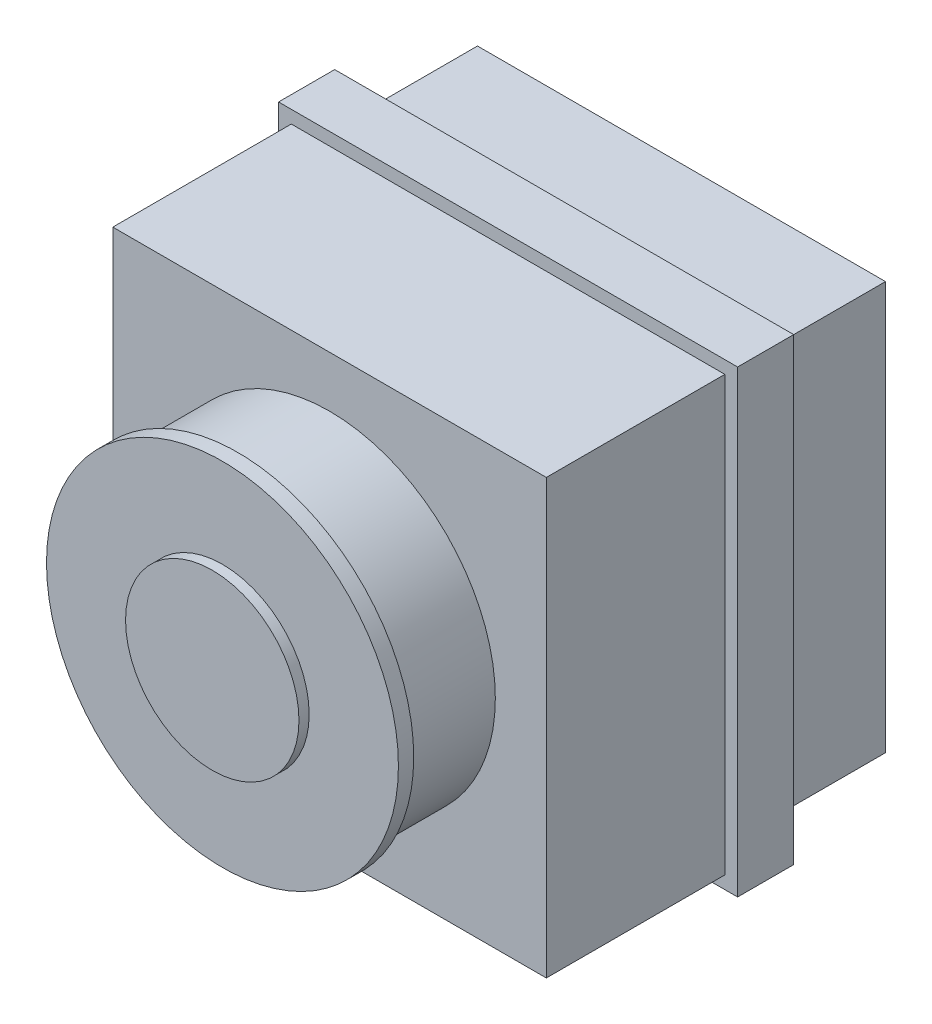
ISO-10303-21;
HEADER;
FILE_DESCRIPTION(('STEP AP214'),'2;1');
FILE_NAME('part.step','',(''),(''),'','','');
FILE_SCHEMA(('AUTOMOTIVE_DESIGN { 1 0 10303 214 1 1 1 1 }'));
ENDSEC;
DATA;
#1=APPLICATION_CONTEXT('core data for automotive mechanical design processes');
#2=APPLICATION_PROTOCOL_DEFINITION('international standard','automotive_design',2000,#1);
#3=PRODUCT_CONTEXT('',#1,'mechanical');
#4=PRODUCT('Part','Part','',(#3));
#5=PRODUCT_RELATED_PRODUCT_CATEGORY('part','',(#4));
#6=PRODUCT_DEFINITION_FORMATION('','',#4);
#7=PRODUCT_DEFINITION_CONTEXT('part definition',#1,'design');
#8=PRODUCT_DEFINITION('design','',#6,#7);
#9=PRODUCT_DEFINITION_SHAPE('','',#8);
#10=(LENGTH_UNIT() NAMED_UNIT(*) SI_UNIT(.MILLI.,.METRE.));
#11=(NAMED_UNIT(*) PLANE_ANGLE_UNIT() SI_UNIT($,.RADIAN.));
#12=(NAMED_UNIT(*) SI_UNIT($,.STERADIAN.) SOLID_ANGLE_UNIT());
#13=UNCERTAINTY_MEASURE_WITH_UNIT(LENGTH_MEASURE(1.E-05),#10,'distance_accuracy_value','');
#14=(GEOMETRIC_REPRESENTATION_CONTEXT(3) GLOBAL_UNCERTAINTY_ASSIGNED_CONTEXT((#13)) GLOBAL_UNIT_ASSIGNED_CONTEXT((#10,
#11,#12)) REPRESENTATION_CONTEXT('',''));
#15=CARTESIAN_POINT('',(0.,0.,0.));
#16=DIRECTION('',(0.,0.,1.));
#17=DIRECTION('',(1.,0.,0.));
#18=AXIS2_PLACEMENT_3D('',#15,#16,#17);
#19=CARTESIAN_POINT('',(26.,-21.,2.3));
#20=DIRECTION('',(1.,0.,0.));
#21=DIRECTION('',(0.,0.,-1.));
#22=AXIS2_PLACEMENT_3D('',#19,#20,#21);
#23=PLANE('',#22);
#24=DIRECTION('',(0.,-1.,0.));
#25=VECTOR('',#24,1.);
#26=CARTESIAN_POINT('',(26.,-21.,0.));
#27=LINE('',#26,#25);
#28=CARTESIAN_POINT('',(26.,-21.,0.));
#29=VERTEX_POINT('',#28);
#30=CARTESIAN_POINT('',(26.,-29.,0.));
#31=VERTEX_POINT('',#30);
#32=EDGE_CURVE('E184',#29,#31,#27,.T.);
#33=ORIENTED_EDGE('',*,*,#32,.T.);
#34=DIRECTION('',(0.,0.,-1.));
#35=VECTOR('',#34,1.);
#36=CARTESIAN_POINT('',(26.,-29.,2.3));
#37=LINE('',#36,#35);
#38=CARTESIAN_POINT('',(26.,-29.,2.3));
#39=VERTEX_POINT('',#38);
#40=EDGE_CURVE('E42',#39,#31,#37,.T.);
#41=ORIENTED_EDGE('',*,*,#40,.F.);
#42=DIRECTION('',(0.,-1.,0.));
#43=VECTOR('',#42,1.);
#44=CARTESIAN_POINT('',(26.,-21.,2.3));
#45=LINE('',#44,#43);
#46=CARTESIAN_POINT('',(26.,-21.,2.3));
#47=VERTEX_POINT('',#46);
#48=EDGE_CURVE('E185',#47,#39,#45,.T.);
#49=ORIENTED_EDGE('',*,*,#48,.F.);
#50=DIRECTION('',(0.,0.,-1.));
#51=VECTOR('',#50,1.);
#52=CARTESIAN_POINT('',(26.,-21.,2.3));
#53=LINE('',#52,#51);
#54=EDGE_CURVE('E198',#47,#29,#53,.T.);
#55=ORIENTED_EDGE('',*,*,#54,.T.);
#56=EDGE_LOOP('',(#33,#41,#49,#55));
#57=FACE_BOUND('',#56,.T.);
#58=ADVANCED_FACE('F39',(#57),#23,.F.);
#59=CARTESIAN_POINT('',(26.,-29.,2.3));
#60=DIRECTION('',(0.,1.,0.));
#61=DIRECTION('',(0.,0.,1.));
#62=AXIS2_PLACEMENT_3D('',#59,#60,#61);
#63=PLANE('',#62);
#64=DIRECTION('',(1.,0.,0.));
#65=VECTOR('',#64,1.);
#66=CARTESIAN_POINT('',(26.,-29.,0.));
#67=LINE('',#66,#65);
#68=CARTESIAN_POINT('',(34.,-29.,0.));
#69=VERTEX_POINT('',#68);
#70=EDGE_CURVE('E201',#31,#69,#67,.T.);
#71=ORIENTED_EDGE('',*,*,#70,.T.);
#72=DIRECTION('',(0.,0.,-1.));
#73=VECTOR('',#72,1.);
#74=CARTESIAN_POINT('',(34.,-29.,2.3));
#75=LINE('',#74,#73);
#76=CARTESIAN_POINT('',(34.,-29.,2.3));
#77=VERTEX_POINT('',#76);
#78=EDGE_CURVE('E210',#77,#69,#75,.T.);
#79=ORIENTED_EDGE('',*,*,#78,.F.);
#80=DIRECTION('',(1.,0.,0.));
#81=VECTOR('',#80,1.);
#82=CARTESIAN_POINT('',(26.,-29.,2.3));
#83=LINE('',#82,#81);
#84=EDGE_CURVE('E188',#39,#77,#83,.T.);
#85=ORIENTED_EDGE('',*,*,#84,.F.);
#86=ORIENTED_EDGE('',*,*,#40,.T.);
#87=EDGE_LOOP('',(#71,#79,#85,#86));
#88=FACE_BOUND('',#87,.T.);
#89=ADVANCED_FACE('F277',(#88),#63,.F.);
#90=CARTESIAN_POINT('',(34.,-29.,2.3));
#91=DIRECTION('',(-1.,0.,0.));
#92=DIRECTION('',(0.,0.,1.));
#93=AXIS2_PLACEMENT_3D('',#90,#91,#92);
#94=PLANE('',#93);
#95=DIRECTION('',(0.,1.,0.));
#96=VECTOR('',#95,1.);
#97=CARTESIAN_POINT('',(34.,-29.,0.));
#98=LINE('',#97,#96);
#99=CARTESIAN_POINT('',(34.,-21.,0.));
#100=VERTEX_POINT('',#99);
#101=EDGE_CURVE('E203',#69,#100,#98,.T.);
#102=ORIENTED_EDGE('',*,*,#101,.T.);
#103=DIRECTION('',(0.,0.,-1.));
#104=VECTOR('',#103,1.);
#105=CARTESIAN_POINT('',(34.,-21.,2.3));
#106=LINE('',#105,#104);
#107=CARTESIAN_POINT('',(34.,-21.,2.3));
#108=VERTEX_POINT('',#107);
#109=EDGE_CURVE('E208',#108,#100,#106,.T.);
#110=ORIENTED_EDGE('',*,*,#109,.F.);
#111=DIRECTION('',(0.,1.,0.));
#112=VECTOR('',#111,1.);
#113=CARTESIAN_POINT('',(34.,-29.,2.3));
#114=LINE('',#113,#112);
#115=EDGE_CURVE('E192',#77,#108,#114,.T.);
#116=ORIENTED_EDGE('',*,*,#115,.F.);
#117=ORIENTED_EDGE('',*,*,#78,.T.);
#118=EDGE_LOOP('',(#102,#110,#116,#117));
#119=FACE_BOUND('',#118,.T.);
#120=ADVANCED_FACE('F278',(#119),#94,.F.);
#121=CARTESIAN_POINT('',(34.,-21.,2.3));
#122=DIRECTION('',(0.,-1.,0.));
#123=DIRECTION('',(0.,0.,-1.));
#124=AXIS2_PLACEMENT_3D('',#121,#122,#123);
#125=PLANE('',#124);
#126=DIRECTION('',(-1.,0.,0.));
#127=VECTOR('',#126,1.);
#128=CARTESIAN_POINT('',(34.,-21.,0.));
#129=LINE('',#128,#127);
#130=EDGE_CURVE('E189',#100,#29,#129,.T.);
#131=ORIENTED_EDGE('',*,*,#130,.T.);
#132=ORIENTED_EDGE('',*,*,#54,.F.);
#133=DIRECTION('',(-1.,0.,0.));
#134=VECTOR('',#133,1.);
#135=CARTESIAN_POINT('',(34.,-21.,2.3));
#136=LINE('',#135,#134);
#137=EDGE_CURVE('E195',#108,#47,#136,.T.);
#138=ORIENTED_EDGE('',*,*,#137,.F.);
#139=ORIENTED_EDGE('',*,*,#109,.T.);
#140=EDGE_LOOP('',(#131,#132,#138,#139));
#141=FACE_BOUND('',#140,.T.);
#142=ADVANCED_FACE('F272',(#141),#125,.F.);
#143=CARTESIAN_POINT('',(0.,0.,0.));
#144=DIRECTION('',(0.,0.,1.));
#145=DIRECTION('',(1.,0.,0.));
#146=AXIS2_PLACEMENT_3D('',#143,#144,#145);
#147=PLANE('',#146);
#148=ORIENTED_EDGE('',*,*,#32,.F.);
#149=ORIENTED_EDGE('',*,*,#130,.F.);
#150=ORIENTED_EDGE('',*,*,#101,.F.);
#151=ORIENTED_EDGE('',*,*,#70,.F.);
#152=EDGE_LOOP('',(#148,#149,#150,#151));
#153=FACE_BOUND('',#152,.T.);
#154=ADVANCED_FACE('F267',(#153),#147,.F.);
#155=CARTESIAN_POINT('',(0.,0.,2.3));
#156=DIRECTION('',(0.,0.,1.));
#157=DIRECTION('',(1.,0.,0.));
#158=AXIS2_PLACEMENT_3D('',#155,#156,#157);
#159=PLANE('',#158);
#160=DIRECTION('',(0.,-1.,0.));
#161=VECTOR('',#160,1.);
#162=CARTESIAN_POINT('',(25.5,-20.5,2.3));
#163=LINE('',#162,#161);
#164=CARTESIAN_POINT('',(25.5,-20.5,2.3));
#165=VERTEX_POINT('',#164);
#166=CARTESIAN_POINT('',(25.5,-29.5,2.3));
#167=VERTEX_POINT('',#166);
#168=EDGE_CURVE('E149',#165,#167,#163,.T.);
#169=ORIENTED_EDGE('',*,*,#168,.F.);
#170=DIRECTION('',(-1.,0.,0.));
#171=VECTOR('',#170,1.);
#172=CARTESIAN_POINT('',(34.5,-20.5,2.3));
#173=LINE('',#172,#171);
#174=CARTESIAN_POINT('',(34.5,-20.5,2.3));
#175=VERTEX_POINT('',#174);
#176=EDGE_CURVE('E162',#175,#165,#173,.T.);
#177=ORIENTED_EDGE('',*,*,#176,.F.);
#178=DIRECTION('',(0.,1.,0.));
#179=VECTOR('',#178,1.);
#180=CARTESIAN_POINT('',(34.5,-29.5,2.3));
#181=LINE('',#180,#179);
#182=CARTESIAN_POINT('',(34.5,-29.5,2.3));
#183=VERTEX_POINT('',#182);
#184=EDGE_CURVE('E170',#183,#175,#181,.T.);
#185=ORIENTED_EDGE('',*,*,#184,.F.);
#186=DIRECTION('',(1.,0.,0.));
#187=VECTOR('',#186,1.);
#188=CARTESIAN_POINT('',(25.5,-29.5,2.3));
#189=LINE('',#188,#187);
#190=EDGE_CURVE('E152',#167,#183,#189,.T.);
#191=ORIENTED_EDGE('',*,*,#190,.F.);
#192=EDGE_LOOP('',(#169,#177,#185,#191));
#193=FACE_BOUND('',#192,.T.);
#194=ORIENTED_EDGE('',*,*,#137,.T.);
#195=ORIENTED_EDGE('',*,*,#48,.T.);
#196=ORIENTED_EDGE('',*,*,#84,.T.);
#197=ORIENTED_EDGE('',*,*,#115,.T.);
#198=EDGE_LOOP('',(#194,#195,#196,#197));
#199=FACE_BOUND('',#198,.T.);
#200=ADVANCED_FACE('F264',(#193,#199),#159,.F.);
#201=CARTESIAN_POINT('',(25.5,-20.5,3.4));
#202=DIRECTION('',(1.,0.,0.));
#203=DIRECTION('',(0.,0.,-1.));
#204=AXIS2_PLACEMENT_3D('',#201,#202,#203);
#205=PLANE('',#204);
#206=ORIENTED_EDGE('',*,*,#168,.T.);
#207=DIRECTION('',(0.,0.,-1.));
#208=VECTOR('',#207,1.);
#209=CARTESIAN_POINT('',(25.5,-29.5,3.4));
#210=LINE('',#209,#208);
#211=CARTESIAN_POINT('',(25.5,-29.5,3.4));
#212=VERTEX_POINT('',#211);
#213=EDGE_CURVE('E181',#212,#167,#210,.T.);
#214=ORIENTED_EDGE('',*,*,#213,.F.);
#215=DIRECTION('',(0.,-1.,0.));
#216=VECTOR('',#215,1.);
#217=CARTESIAN_POINT('',(25.5,-20.5,3.4));
#218=LINE('',#217,#216);
#219=CARTESIAN_POINT('',(25.5,-20.5,3.4));
#220=VERTEX_POINT('',#219);
#221=EDGE_CURVE('E158',#220,#212,#218,.T.);
#222=ORIENTED_EDGE('',*,*,#221,.F.);
#223=DIRECTION('',(0.,0.,-1.));
#224=VECTOR('',#223,1.);
#225=CARTESIAN_POINT('',(25.5,-20.5,3.4));
#226=LINE('',#225,#224);
#227=EDGE_CURVE('E167',#220,#165,#226,.T.);
#228=ORIENTED_EDGE('',*,*,#227,.T.);
#229=EDGE_LOOP('',(#206,#214,#222,#228));
#230=FACE_BOUND('',#229,.T.);
#231=ADVANCED_FACE('F252',(#230),#205,.F.);
#232=CARTESIAN_POINT('',(25.5,-29.5,3.4));
#233=DIRECTION('',(0.,1.,0.));
#234=DIRECTION('',(0.,0.,1.));
#235=AXIS2_PLACEMENT_3D('',#232,#233,#234);
#236=PLANE('',#235);
#237=ORIENTED_EDGE('',*,*,#190,.T.);
#238=DIRECTION('',(0.,0.,-1.));
#239=VECTOR('',#238,1.);
#240=CARTESIAN_POINT('',(34.5,-29.5,3.4));
#241=LINE('',#240,#239);
#242=CARTESIAN_POINT('',(34.5,-29.5,3.4));
#243=VERTEX_POINT('',#242);
#244=EDGE_CURVE('E178',#243,#183,#241,.T.);
#245=ORIENTED_EDGE('',*,*,#244,.F.);
#246=DIRECTION('',(1.,0.,0.));
#247=VECTOR('',#246,1.);
#248=CARTESIAN_POINT('',(25.5,-29.5,3.4));
#249=LINE('',#248,#247);
#250=EDGE_CURVE('E161',#212,#243,#249,.T.);
#251=ORIENTED_EDGE('',*,*,#250,.F.);
#252=ORIENTED_EDGE('',*,*,#213,.T.);
#253=EDGE_LOOP('',(#237,#245,#251,#252));
#254=FACE_BOUND('',#253,.T.);
#255=ADVANCED_FACE('F255',(#254),#236,.F.);
#256=CARTESIAN_POINT('',(34.5,-29.5,3.4));
#257=DIRECTION('',(-1.,0.,0.));
#258=DIRECTION('',(0.,0.,1.));
#259=AXIS2_PLACEMENT_3D('',#256,#257,#258);
#260=PLANE('',#259);
#261=ORIENTED_EDGE('',*,*,#184,.T.);
#262=DIRECTION('',(0.,0.,-1.));
#263=VECTOR('',#262,1.);
#264=CARTESIAN_POINT('',(34.5,-20.5,3.4));
#265=LINE('',#264,#263);
#266=CARTESIAN_POINT('',(34.5,-20.5,3.4));
#267=VERTEX_POINT('',#266);
#268=EDGE_CURVE('E175',#267,#175,#265,.T.);
#269=ORIENTED_EDGE('',*,*,#268,.F.);
#270=DIRECTION('',(0.,1.,0.));
#271=VECTOR('',#270,1.);
#272=CARTESIAN_POINT('',(34.5,-29.5,3.4));
#273=LINE('',#272,#271);
#274=EDGE_CURVE('E164',#243,#267,#273,.T.);
#275=ORIENTED_EDGE('',*,*,#274,.F.);
#276=ORIENTED_EDGE('',*,*,#244,.T.);
#277=EDGE_LOOP('',(#261,#269,#275,#276));
#278=FACE_BOUND('',#277,.T.);
#279=ADVANCED_FACE('F260',(#278),#260,.F.);
#280=CARTESIAN_POINT('',(34.5,-20.5,3.4));
#281=DIRECTION('',(0.,-1.,0.));
#282=DIRECTION('',(0.,0.,-1.));
#283=AXIS2_PLACEMENT_3D('',#280,#281,#282);
#284=PLANE('',#283);
#285=ORIENTED_EDGE('',*,*,#176,.T.);
#286=ORIENTED_EDGE('',*,*,#227,.F.);
#287=DIRECTION('',(-1.,0.,0.));
#288=VECTOR('',#287,1.);
#289=CARTESIAN_POINT('',(34.5,-20.5,3.4));
#290=LINE('',#289,#288);
#291=EDGE_CURVE('E166',#267,#220,#290,.T.);
#292=ORIENTED_EDGE('',*,*,#291,.F.);
#293=ORIENTED_EDGE('',*,*,#268,.T.);
#294=EDGE_LOOP('',(#285,#286,#292,#293));
#295=FACE_BOUND('',#294,.T.);
#296=ADVANCED_FACE('F244',(#295),#284,.F.);
#297=CARTESIAN_POINT('',(0.,0.,3.4));
#298=DIRECTION('',(0.,0.,1.));
#299=DIRECTION('',(1.,0.,0.));
#300=AXIS2_PLACEMENT_3D('',#297,#298,#299);
#301=PLANE('',#300);
#302=DIRECTION('',(0.,-1.,0.));
#303=VECTOR('',#302,1.);
#304=CARTESIAN_POINT('',(25.75,-20.75,3.4));
#305=LINE('',#304,#303);
#306=CARTESIAN_POINT('',(25.75,-20.75,3.4));
#307=VERTEX_POINT('',#306);
#308=CARTESIAN_POINT('',(25.75,-29.25,3.4));
#309=VERTEX_POINT('',#308);
#310=EDGE_CURVE('E55',#307,#309,#305,.T.);
#311=ORIENTED_EDGE('',*,*,#310,.F.);
#312=DIRECTION('',(-1.,0.,0.));
#313=VECTOR('',#312,1.);
#314=CARTESIAN_POINT('',(34.25,-20.75,3.4));
#315=LINE('',#314,#313);
#316=CARTESIAN_POINT('',(34.25,-20.75,3.4));
#317=VERTEX_POINT('',#316);
#318=EDGE_CURVE('E59',#317,#307,#315,.T.);
#319=ORIENTED_EDGE('',*,*,#318,.F.);
#320=DIRECTION('',(0.,1.,0.));
#321=VECTOR('',#320,1.);
#322=CARTESIAN_POINT('',(34.25,-29.25,3.4));
#323=LINE('',#322,#321);
#324=CARTESIAN_POINT('',(34.25,-29.25,3.4));
#325=VERTEX_POINT('',#324);
#326=EDGE_CURVE('E232',#325,#317,#323,.T.);
#327=ORIENTED_EDGE('',*,*,#326,.F.);
#328=DIRECTION('',(1.,0.,0.));
#329=VECTOR('',#328,1.);
#330=CARTESIAN_POINT('',(25.75,-29.25,3.4));
#331=LINE('',#330,#329);
#332=EDGE_CURVE('E230',#309,#325,#331,.T.);
#333=ORIENTED_EDGE('',*,*,#332,.F.);
#334=EDGE_LOOP('',(#311,#319,#327,#333));
#335=FACE_BOUND('',#334,.T.);
#336=ORIENTED_EDGE('',*,*,#221,.T.);
#337=ORIENTED_EDGE('',*,*,#250,.T.);
#338=ORIENTED_EDGE('',*,*,#274,.T.);
#339=ORIENTED_EDGE('',*,*,#291,.T.);
#340=EDGE_LOOP('',(#336,#337,#338,#339));
#341=FACE_BOUND('',#340,.T.);
#342=ADVANCED_FACE('F241',(#335,#341),#301,.T.);
#343=CARTESIAN_POINT('',(25.75,-20.75,6.9));
#344=DIRECTION('',(1.,0.,0.));
#345=DIRECTION('',(0.,0.,-1.));
#346=AXIS2_PLACEMENT_3D('',#343,#344,#345);
#347=PLANE('',#346);
#348=ORIENTED_EDGE('',*,*,#310,.T.);
#349=DIRECTION('',(0.,0.,-1.));
#350=VECTOR('',#349,1.);
#351=CARTESIAN_POINT('',(25.75,-29.25,6.9));
#352=LINE('',#351,#350);
#353=CARTESIAN_POINT('',(25.75,-29.25,6.9));
#354=VERTEX_POINT('',#353);
#355=EDGE_CURVE('E132',#354,#309,#352,.T.);
#356=ORIENTED_EDGE('',*,*,#355,.F.);
#357=DIRECTION('',(0.,-1.,0.));
#358=VECTOR('',#357,1.);
#359=CARTESIAN_POINT('',(25.75,-20.75,6.9));
#360=LINE('',#359,#358);
#361=CARTESIAN_POINT('',(25.75,-20.75,6.9));
#362=VERTEX_POINT('',#361);
#363=EDGE_CURVE('E138',#362,#354,#360,.T.);
#364=ORIENTED_EDGE('',*,*,#363,.F.);
#365=DIRECTION('',(0.,0.,-1.));
#366=VECTOR('',#365,1.);
#367=CARTESIAN_POINT('',(25.75,-20.75,6.9));
#368=LINE('',#367,#366);
#369=EDGE_CURVE('E228',#362,#307,#368,.T.);
#370=ORIENTED_EDGE('',*,*,#369,.T.);
#371=EDGE_LOOP('',(#348,#356,#364,#370));
#372=FACE_BOUND('',#371,.T.);
#373=ADVANCED_FACE('F148',(#372),#347,.F.);
#374=CARTESIAN_POINT('',(25.75,-29.25,6.9));
#375=DIRECTION('',(0.,1.,0.));
#376=DIRECTION('',(0.,0.,1.));
#377=AXIS2_PLACEMENT_3D('',#374,#375,#376);
#378=PLANE('',#377);
#379=ORIENTED_EDGE('',*,*,#332,.T.);
#380=DIRECTION('',(0.,0.,-1.));
#381=VECTOR('',#380,1.);
#382=CARTESIAN_POINT('',(34.25,-29.25,6.9));
#383=LINE('',#382,#381);
#384=CARTESIAN_POINT('',(34.25,-29.25,6.9));
#385=VERTEX_POINT('',#384);
#386=EDGE_CURVE('E134',#385,#325,#383,.T.);
#387=ORIENTED_EDGE('',*,*,#386,.F.);
#388=DIRECTION('',(1.,0.,0.));
#389=VECTOR('',#388,1.);
#390=CARTESIAN_POINT('',(25.75,-29.25,6.9));
#391=LINE('',#390,#389);
#392=EDGE_CURVE('E127',#354,#385,#391,.T.);
#393=ORIENTED_EDGE('',*,*,#392,.F.);
#394=ORIENTED_EDGE('',*,*,#355,.T.);
#395=EDGE_LOOP('',(#379,#387,#393,#394));
#396=FACE_BOUND('',#395,.T.);
#397=ADVANCED_FACE('F130',(#396),#378,.F.);
#398=CARTESIAN_POINT('',(34.25,-29.25,6.9));
#399=DIRECTION('',(-1.,0.,0.));
#400=DIRECTION('',(0.,0.,1.));
#401=AXIS2_PLACEMENT_3D('',#398,#399,#400);
#402=PLANE('',#401);
#403=ORIENTED_EDGE('',*,*,#326,.T.);
#404=DIRECTION('',(0.,0.,-1.));
#405=VECTOR('',#404,1.);
#406=CARTESIAN_POINT('',(34.25,-20.75,6.9));
#407=LINE('',#406,#405);
#408=CARTESIAN_POINT('',(34.25,-20.75,6.9));
#409=VERTEX_POINT('',#408);
#410=EDGE_CURVE('E154',#409,#317,#407,.T.);
#411=ORIENTED_EDGE('',*,*,#410,.F.);
#412=DIRECTION('',(0.,1.,0.));
#413=VECTOR('',#412,1.);
#414=CARTESIAN_POINT('',(34.25,-29.25,6.9));
#415=LINE('',#414,#413);
#416=EDGE_CURVE('E137',#385,#409,#415,.T.);
#417=ORIENTED_EDGE('',*,*,#416,.F.);
#418=ORIENTED_EDGE('',*,*,#386,.T.);
#419=EDGE_LOOP('',(#403,#411,#417,#418));
#420=FACE_BOUND('',#419,.T.);
#421=ADVANCED_FACE('F240',(#420),#402,.F.);
#422=CARTESIAN_POINT('',(34.25,-20.75,6.9));
#423=DIRECTION('',(0.,-1.,0.));
#424=DIRECTION('',(0.,0.,-1.));
#425=AXIS2_PLACEMENT_3D('',#422,#423,#424);
#426=PLANE('',#425);
#427=ORIENTED_EDGE('',*,*,#318,.T.);
#428=ORIENTED_EDGE('',*,*,#369,.F.);
#429=DIRECTION('',(-1.,0.,0.));
#430=VECTOR('',#429,1.);
#431=CARTESIAN_POINT('',(34.25,-20.75,6.9));
#432=LINE('',#431,#430);
#433=EDGE_CURVE('E143',#409,#362,#432,.T.);
#434=ORIENTED_EDGE('',*,*,#433,.F.);
#435=ORIENTED_EDGE('',*,*,#410,.T.);
#436=EDGE_LOOP('',(#427,#428,#434,#435));
#437=FACE_BOUND('',#436,.T.);
#438=ADVANCED_FACE('F238',(#437),#426,.F.);
#439=CARTESIAN_POINT('',(0.,0.,6.9));
#440=DIRECTION('',(0.,0.,1.));
#441=DIRECTION('',(1.,0.,0.));
#442=AXIS2_PLACEMENT_3D('',#439,#440,#441);
#443=PLANE('',#442);
#444=CARTESIAN_POINT('',(30.,-25.,6.9));
#445=DIRECTION('',(0.,0.,1.));
#446=DIRECTION('',(1.,0.,0.));
#447=AXIS2_PLACEMENT_3D('',#444,#445,#446);
#448=CIRCLE('',#447,3.25);
#449=CARTESIAN_POINT('',(33.25,-25.,6.9));
#450=VERTEX_POINT('',#449);
#451=EDGE_CURVE('E47',#450,#450,#448,.T.);
#452=ORIENTED_EDGE('',*,*,#451,.F.);
#453=EDGE_LOOP('',(#452));
#454=FACE_BOUND('',#453,.T.);
#455=ORIENTED_EDGE('',*,*,#363,.T.);
#456=ORIENTED_EDGE('',*,*,#392,.T.);
#457=ORIENTED_EDGE('',*,*,#416,.T.);
#458=ORIENTED_EDGE('',*,*,#433,.T.);
#459=EDGE_LOOP('',(#455,#456,#457,#458));
#460=FACE_BOUND('',#459,.T.);
#461=ADVANCED_FACE('F141',(#454,#460),#443,.T.);
#462=CARTESIAN_POINT('',(30.,-25.,8.7));
#463=DIRECTION('',(0.,0.,-1.));
#464=DIRECTION('',(-1.,0.,0.));
#465=AXIS2_PLACEMENT_3D('',#462,#463,#464);
#466=CYLINDRICAL_SURFACE('',#465,3.25);
#467=CARTESIAN_POINT('',(30.,-25.,8.7));
#468=DIRECTION('',(0.,0.,1.));
#469=DIRECTION('',(1.,0.,0.));
#470=AXIS2_PLACEMENT_3D('',#467,#468,#469);
#471=CIRCLE('',#470,3.25);
#472=CARTESIAN_POINT('',(33.25,-25.,8.7));
#473=VERTEX_POINT('',#472);
#474=EDGE_CURVE('E223',#473,#473,#471,.T.);
#475=ORIENTED_EDGE('',*,*,#474,.F.);
#476=EDGE_LOOP('',(#475));
#477=FACE_BOUND('',#476,.T.);
#478=ORIENTED_EDGE('',*,*,#451,.T.);
#479=EDGE_LOOP('',(#478));
#480=FACE_BOUND('',#479,.T.);
#481=ADVANCED_FACE('F404',(#477,#480),#466,.T.);
#482=CARTESIAN_POINT('',(30.,-25.,9.));
#483=DIRECTION('',(0.,0.,-1.));
#484=DIRECTION('',(-1.,0.,0.));
#485=AXIS2_PLACEMENT_3D('',#482,#483,#484);
#486=CYLINDRICAL_SURFACE('',#485,3.45);
#487=CARTESIAN_POINT('',(30.,-25.,9.));
#488=DIRECTION('',(0.,0.,1.));
#489=DIRECTION('',(1.,0.,0.));
#490=AXIS2_PLACEMENT_3D('',#487,#488,#489);
#491=CIRCLE('',#490,3.45);
#492=CARTESIAN_POINT('',(33.45,-25.,9.));
#493=VERTEX_POINT('',#492);
#494=EDGE_CURVE('E512',#493,#493,#491,.T.);
#495=ORIENTED_EDGE('',*,*,#494,.F.);
#496=EDGE_LOOP('',(#495));
#497=FACE_BOUND('',#496,.T.);
#498=CARTESIAN_POINT('',(30.,-25.,8.7));
#499=DIRECTION('',(0.,0.,1.));
#500=DIRECTION('',(1.,0.,0.));
#501=AXIS2_PLACEMENT_3D('',#498,#499,#500);
#502=CIRCLE('',#501,3.45);
#503=CARTESIAN_POINT('',(33.45,-25.,8.7));
#504=VERTEX_POINT('',#503);
#505=EDGE_CURVE('E509',#504,#504,#502,.T.);
#506=ORIENTED_EDGE('',*,*,#505,.T.);
#507=EDGE_LOOP('',(#506));
#508=FACE_BOUND('',#507,.T.);
#509=ADVANCED_FACE('F415',(#497,#508),#486,.T.);
#510=CARTESIAN_POINT('',(30.,-25.,9.));
#511=DIRECTION('',(0.,0.,1.));
#512=DIRECTION('',(1.,0.,0.));
#513=AXIS2_PLACEMENT_3D('',#510,#511,#512);
#514=PLANE('',#513);
#515=CARTESIAN_POINT('',(30.,-25.,9.));
#516=DIRECTION('',(0.,0.,1.));
#517=DIRECTION('',(1.,0.,0.));
#518=AXIS2_PLACEMENT_3D('',#515,#516,#517);
#519=CIRCLE('',#518,1.7);
#520=CARTESIAN_POINT('',(31.7,-25.,9.));
#521=VERTEX_POINT('',#520);
#522=EDGE_CURVE('E11',#521,#521,#519,.T.);
#523=ORIENTED_EDGE('',*,*,#522,.F.);
#524=EDGE_LOOP('',(#523));
#525=FACE_BOUND('',#524,.T.);
#526=ORIENTED_EDGE('',*,*,#494,.T.);
#527=EDGE_LOOP('',(#526));
#528=FACE_BOUND('',#527,.T.);
#529=ADVANCED_FACE('F426',(#525,#528),#514,.T.);
#530=CARTESIAN_POINT('',(30.,-25.,8.7));
#531=DIRECTION('',(0.,0.,1.));
#532=DIRECTION('',(1.,0.,0.));
#533=AXIS2_PLACEMENT_3D('',#530,#531,#532);
#534=PLANE('',#533);
#535=ORIENTED_EDGE('',*,*,#474,.T.);
#536=EDGE_LOOP('',(#535));
#537=FACE_BOUND('',#536,.T.);
#538=ORIENTED_EDGE('',*,*,#505,.F.);
#539=EDGE_LOOP('',(#538));
#540=FACE_BOUND('',#539,.T.);
#541=ADVANCED_FACE('F435',(#537,#540),#534,.F.);
#542=CARTESIAN_POINT('',(30.,-25.,9.2));
#543=DIRECTION('',(0.,0.,-1.));
#544=DIRECTION('',(-1.,0.,0.));
#545=AXIS2_PLACEMENT_3D('',#542,#543,#544);
#546=CYLINDRICAL_SURFACE('',#545,1.7);
#547=CARTESIAN_POINT('',(30.,-25.,9.2));
#548=DIRECTION('',(0.,0.,1.));
#549=DIRECTION('',(1.,0.,0.));
#550=AXIS2_PLACEMENT_3D('',#547,#548,#549);
#551=CIRCLE('',#550,1.7);
#552=CARTESIAN_POINT('',(31.7,-25.,9.2));
#553=VERTEX_POINT('',#552);
#554=EDGE_CURVE('E508',#553,#553,#551,.T.);
#555=ORIENTED_EDGE('',*,*,#554,.F.);
#556=EDGE_LOOP('',(#555));
#557=FACE_BOUND('',#556,.T.);
#558=ORIENTED_EDGE('',*,*,#522,.T.);
#559=EDGE_LOOP('',(#558));
#560=FACE_BOUND('',#559,.T.);
#561=ADVANCED_FACE('F440',(#557,#560),#546,.T.);
#562=CARTESIAN_POINT('',(30.,-25.,9.2));
#563=DIRECTION('',(0.,0.,1.));
#564=DIRECTION('',(1.,0.,0.));
#565=AXIS2_PLACEMENT_3D('',#562,#563,#564);
#566=PLANE('',#565);
#567=ORIENTED_EDGE('',*,*,#554,.T.);
#568=EDGE_LOOP('',(#567));
#569=FACE_BOUND('',#568,.T.);
#570=ADVANCED_FACE('F459',(#569),#566,.T.);
#571=CLOSED_SHELL('',(#58,#89,#120,#142,#154,#200,#231,#255,#279,#296,#342,#373,#397,#421,#438,
#461,#481,#509,#529,#541,#561,#570));
#572=MANIFOLD_SOLID_BREP('B2',#571);
#573=ADVANCED_BREP_SHAPE_REPRESENTATION('',(#18,#572),#14);
#574=SHAPE_DEFINITION_REPRESENTATION(#9,#573);
ENDSEC;
END-ISO-10303-21;
